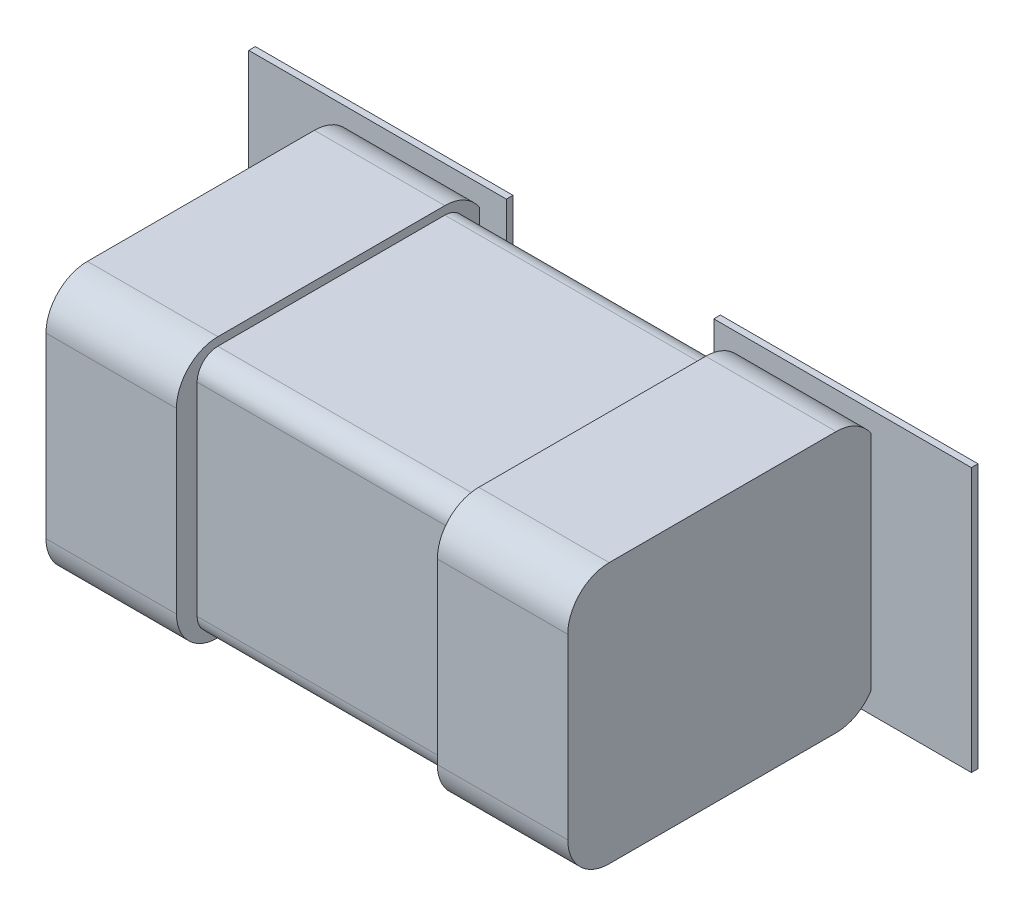
ISO-10303-21;
HEADER;
FILE_DESCRIPTION(('STEP AP214'),'2;1');
FILE_NAME('part.step','',(''),(''),'','','');
FILE_SCHEMA(('AUTOMOTIVE_DESIGN { 1 0 10303 214 1 1 1 1 }'));
ENDSEC;
DATA;
#1=APPLICATION_CONTEXT('core data for automotive mechanical design processes');
#2=APPLICATION_PROTOCOL_DEFINITION('international standard','automotive_design',2000,#1);
#3=PRODUCT_CONTEXT('',#1,'mechanical');
#4=PRODUCT('Part','Part','',(#3));
#5=PRODUCT_RELATED_PRODUCT_CATEGORY('part','',(#4));
#6=PRODUCT_DEFINITION_FORMATION('','',#4);
#7=PRODUCT_DEFINITION_CONTEXT('part definition',#1,'design');
#8=PRODUCT_DEFINITION('design','',#6,#7);
#9=PRODUCT_DEFINITION_SHAPE('','',#8);
#10=(LENGTH_UNIT() NAMED_UNIT(*) SI_UNIT(.MILLI.,.METRE.));
#11=(NAMED_UNIT(*) PLANE_ANGLE_UNIT() SI_UNIT($,.RADIAN.));
#12=(NAMED_UNIT(*) SI_UNIT($,.STERADIAN.) SOLID_ANGLE_UNIT());
#13=UNCERTAINTY_MEASURE_WITH_UNIT(LENGTH_MEASURE(1.E-05),#10,'distance_accuracy_value','');
#14=(GEOMETRIC_REPRESENTATION_CONTEXT(3) GLOBAL_UNCERTAINTY_ASSIGNED_CONTEXT((#13)) GLOBAL_UNIT_ASSIGNED_CONTEXT((#10,
#11,#12)) REPRESENTATION_CONTEXT('',''));
#15=CARTESIAN_POINT('',(0.,0.,0.));
#16=DIRECTION('',(0.,0.,1.));
#17=DIRECTION('',(1.,0.,0.));
#18=AXIS2_PLACEMENT_3D('',#15,#16,#17);
#19=CARTESIAN_POINT('',(0.,0.,0.0762));
#20=DIRECTION('',(0.,0.,1.));
#21=DIRECTION('',(1.,0.,0.));
#22=AXIS2_PLACEMENT_3D('',#19,#20,#21);
#23=PLANE('',#22);
#24=DIRECTION('',(0.,1.,0.));
#25=VECTOR('',#24,1.);
#26=CARTESIAN_POINT('',(0.318008,0.405003,0.0762));
#27=LINE('',#26,#25);
#28=CARTESIAN_POINT('',(0.318008,0.405003,0.0762));
#29=VERTEX_POINT('',#28);
#30=CARTESIAN_POINT('',(0.318008,-0.405003,0.0762));
#31=VERTEX_POINT('',#30);
#32=EDGE_CURVE('E229',#29,#31,#27,.F.);
#33=ORIENTED_EDGE('',*,*,#32,.F.);
#34=DIRECTION('',(1.,0.,0.));
#35=VECTOR('',#34,1.);
#36=CARTESIAN_POINT('',(1.1079988,0.405003,0.0762));
#37=LINE('',#36,#35);
#38=CARTESIAN_POINT('',(1.1079988,0.405003,0.0762));
#39=VERTEX_POINT('',#38);
#40=EDGE_CURVE('E216',#39,#29,#37,.F.);
#41=ORIENTED_EDGE('',*,*,#40,.F.);
#42=DIRECTION('',(0.,1.,0.));
#43=VECTOR('',#42,1.);
#44=CARTESIAN_POINT('',(1.1079988,-0.405003,0.0762));
#45=LINE('',#44,#43);
#46=CARTESIAN_POINT('',(1.1079988,-0.405003,0.0762));
#47=VERTEX_POINT('',#46);
#48=EDGE_CURVE('E357',#47,#39,#45,.T.);
#49=ORIENTED_EDGE('',*,*,#48,.F.);
#50=DIRECTION('',(1.,0.,0.));
#51=VECTOR('',#50,1.);
#52=CARTESIAN_POINT('',(0.318008,-0.405003,0.0762));
#53=LINE('',#52,#51);
#54=EDGE_CURVE('E230',#31,#47,#53,.T.);
#55=ORIENTED_EDGE('',*,*,#54,.F.);
#56=EDGE_LOOP('',(#33,#41,#49,#55));
#57=FACE_BOUND('',#56,.T.);
#58=ADVANCED_FACE('F17',(#57),#23,.F.);
#59=CARTESIAN_POINT('',(1.1079988,0.405003,0.0762));
#60=DIRECTION('',(0.,1.,0.));
#61=DIRECTION('',(0.,0.,1.));
#62=AXIS2_PLACEMENT_3D('',#59,#60,#61);
#63=PLANE('',#62);
#64=DIRECTION('',(0.,0.,-1.));
#65=VECTOR('',#64,1.);
#66=CARTESIAN_POINT('',(1.1079988,0.405003,0.0762));
#67=LINE('',#66,#65);
#68=CARTESIAN_POINT('',(1.1079988,0.405003,0.09652));
#69=VERTEX_POINT('',#68);
#70=EDGE_CURVE('E223',#39,#69,#67,.F.);
#71=ORIENTED_EDGE('',*,*,#70,.F.);
#72=ORIENTED_EDGE('',*,*,#40,.T.);
#73=DIRECTION('',(0.,0.,1.));
#74=VECTOR('',#73,1.);
#75=CARTESIAN_POINT('',(0.318008,0.405003,0.0762));
#76=LINE('',#75,#74);
#77=CARTESIAN_POINT('',(0.318008,0.405003,0.09652));
#78=VERTEX_POINT('',#77);
#79=EDGE_CURVE('E220',#78,#29,#76,.F.);
#80=ORIENTED_EDGE('',*,*,#79,.F.);
#81=DIRECTION('',(1.,0.,0.));
#82=VECTOR('',#81,1.);
#83=CARTESIAN_POINT('',(0.,0.405003,0.09652));
#84=LINE('',#83,#82);
#85=EDGE_CURVE('E355',#69,#78,#84,.F.);
#86=ORIENTED_EDGE('',*,*,#85,.F.);
#87=EDGE_LOOP('',(#71,#72,#80,#86));
#88=FACE_BOUND('',#87,.T.);
#89=ADVANCED_FACE('F218',(#88),#63,.T.);
#90=CARTESIAN_POINT('',(0.318008,0.405003,0.0762));
#91=DIRECTION('',(-1.,0.,0.));
#92=DIRECTION('',(0.,0.,1.));
#93=AXIS2_PLACEMENT_3D('',#90,#91,#92);
#94=PLANE('',#93);
#95=ORIENTED_EDGE('',*,*,#79,.T.);
#96=ORIENTED_EDGE('',*,*,#32,.T.);
#97=DIRECTION('',(0.,0.,-1.));
#98=VECTOR('',#97,1.);
#99=CARTESIAN_POINT('',(0.318008,-0.405003,0.0762));
#100=LINE('',#99,#98);
#101=CARTESIAN_POINT('',(0.318008,-0.405003,0.09652));
#102=VERTEX_POINT('',#101);
#103=EDGE_CURVE('E233',#102,#31,#100,.T.);
#104=ORIENTED_EDGE('',*,*,#103,.F.);
#105=DIRECTION('',(0.,1.,0.));
#106=VECTOR('',#105,1.);
#107=CARTESIAN_POINT('',(0.318008,0.,0.09652));
#108=LINE('',#107,#106);
#109=EDGE_CURVE('E237',#78,#102,#108,.F.);
#110=ORIENTED_EDGE('',*,*,#109,.F.);
#111=EDGE_LOOP('',(#95,#96,#104,#110));
#112=FACE_BOUND('',#111,.T.);
#113=ADVANCED_FACE('F235',(#112),#94,.T.);
#114=CARTESIAN_POINT('',(0.318008,-0.405003,0.0762));
#115=DIRECTION('',(0.,-1.,0.));
#116=DIRECTION('',(0.,0.,-1.));
#117=AXIS2_PLACEMENT_3D('',#114,#115,#116);
#118=PLANE('',#117);
#119=ORIENTED_EDGE('',*,*,#103,.T.);
#120=ORIENTED_EDGE('',*,*,#54,.T.);
#121=DIRECTION('',(0.,0.,-1.));
#122=VECTOR('',#121,1.);
#123=CARTESIAN_POINT('',(1.1079988,-0.405003,0.0762));
#124=LINE('',#123,#122);
#125=CARTESIAN_POINT('',(1.1079988,-0.405003,0.09652));
#126=VERTEX_POINT('',#125);
#127=EDGE_CURVE('E192',#126,#47,#124,.T.);
#128=ORIENTED_EDGE('',*,*,#127,.F.);
#129=DIRECTION('',(1.,0.,0.));
#130=VECTOR('',#129,1.);
#131=CARTESIAN_POINT('',(0.,-0.405003,0.09652));
#132=LINE('',#131,#130);
#133=EDGE_CURVE('E351',#102,#126,#132,.T.);
#134=ORIENTED_EDGE('',*,*,#133,.F.);
#135=EDGE_LOOP('',(#119,#120,#128,#134));
#136=FACE_BOUND('',#135,.T.);
#137=ADVANCED_FACE('F368',(#136),#118,.T.);
#138=CARTESIAN_POINT('',(1.1079988,-0.405003,0.0762));
#139=DIRECTION('',(1.,0.,0.));
#140=DIRECTION('',(0.,0.,-1.));
#141=AXIS2_PLACEMENT_3D('',#138,#139,#140);
#142=PLANE('',#141);
#143=ORIENTED_EDGE('',*,*,#127,.T.);
#144=ORIENTED_EDGE('',*,*,#48,.T.);
#145=ORIENTED_EDGE('',*,*,#70,.T.);
#146=DIRECTION('',(0.,1.,0.));
#147=VECTOR('',#146,1.);
#148=CARTESIAN_POINT('',(1.1079988,0.,0.09652));
#149=LINE('',#148,#147);
#150=EDGE_CURVE('E348',#126,#69,#149,.T.);
#151=ORIENTED_EDGE('',*,*,#150,.F.);
#152=EDGE_LOOP('',(#143,#144,#145,#151));
#153=FACE_BOUND('',#152,.T.);
#154=ADVANCED_FACE('F372',(#153),#142,.T.);
#155=CARTESIAN_POINT('',(0.800000000000102,-0.399999999999924,0.0762));
#156=DIRECTION('',(1.,0.,0.));
#157=DIRECTION('',(0.,0.,-1.));
#158=AXIS2_PLACEMENT_3D('',#155,#156,#157);
#159=PLANE('',#158);
#160=CARTESIAN_POINT('',(0.800000000000102,-0.272999999999924,0.2032));
#161=DIRECTION('',(1.,0.,0.));
#162=DIRECTION('',(0.,0.,-1.));
#163=AXIS2_PLACEMENT_3D('',#160,#161,#162);
#164=CIRCLE('',#163,0.127);
#165=CARTESIAN_POINT('',(0.800000000000102,-0.341908472628476,0.0965199999999994));
#166=VERTEX_POINT('',#165);
#167=CARTESIAN_POINT('',(0.800000000000102,-0.399999999999924,0.2032));
#168=VERTEX_POINT('',#167);
#169=EDGE_CURVE('E319',#166,#168,#164,.F.);
#170=ORIENTED_EDGE('',*,*,#169,.F.);
#171=DIRECTION('',(0.,1.,0.));
#172=VECTOR('',#171,1.);
#173=CARTESIAN_POINT('',(0.800000000000102,0.,0.09652));
#174=LINE('',#173,#172);
#175=CARTESIAN_POINT('',(0.800000000000102,0.341908472628476,0.0965199999999994));
#176=VERTEX_POINT('',#175);
#177=EDGE_CURVE('E183',#176,#166,#174,.F.);
#178=ORIENTED_EDGE('',*,*,#177,.F.);
#179=CARTESIAN_POINT('',(0.800000000000102,0.272999999999924,0.2032));
#180=DIRECTION('',(1.,0.,0.));
#181=DIRECTION('',(0.,0.,-1.));
#182=AXIS2_PLACEMENT_3D('',#179,#180,#181);
#183=CIRCLE('',#182,0.127);
#184=CARTESIAN_POINT('',(0.800000000000102,0.399999999999924,0.2032));
#185=VERTEX_POINT('',#184);
#186=EDGE_CURVE('E20',#185,#176,#183,.F.);
#187=ORIENTED_EDGE('',*,*,#186,.F.);
#188=DIRECTION('',(0.,0.,1.));
#189=VECTOR('',#188,1.);
#190=CARTESIAN_POINT('',(0.800000000000102,0.399999999999924,0.0762));
#191=LINE('',#190,#189);
#192=CARTESIAN_POINT('',(0.800000000000102,0.399999999999924,0.89916));
#193=VERTEX_POINT('',#192);
#194=EDGE_CURVE('E337',#193,#185,#191,.F.);
#195=ORIENTED_EDGE('',*,*,#194,.F.);
#196=CARTESIAN_POINT('',(0.800000000000102,0.272999999999924,0.89916));
#197=DIRECTION('',(-1.,0.,0.));
#198=DIRECTION('',(0.,0.,1.));
#199=AXIS2_PLACEMENT_3D('',#196,#197,#198);
#200=CIRCLE('',#199,0.127);
#201=CARTESIAN_POINT('',(0.800000000000102,0.272999999999924,1.02616));
#202=VERTEX_POINT('',#201);
#203=EDGE_CURVE('E327',#202,#193,#200,.T.);
#204=ORIENTED_EDGE('',*,*,#203,.F.);
#205=DIRECTION('',(0.,1.,0.));
#206=VECTOR('',#205,1.);
#207=CARTESIAN_POINT('',(0.800000000000102,0.,1.02616));
#208=LINE('',#207,#206);
#209=CARTESIAN_POINT('',(0.800000000000102,-0.272999999999924,1.02616));
#210=VERTEX_POINT('',#209);
#211=EDGE_CURVE('E334',#210,#202,#208,.T.);
#212=ORIENTED_EDGE('',*,*,#211,.F.);
#213=CARTESIAN_POINT('',(0.800000000000102,-0.272999999999924,0.89916));
#214=DIRECTION('',(1.,0.,0.));
#215=DIRECTION('',(0.,0.,-1.));
#216=AXIS2_PLACEMENT_3D('',#213,#214,#215);
#217=CIRCLE('',#216,0.127);
#218=CARTESIAN_POINT('',(0.800000000000102,-0.399999999999924,0.89916));
#219=VERTEX_POINT('',#218);
#220=EDGE_CURVE('E323',#219,#210,#217,.F.);
#221=ORIENTED_EDGE('',*,*,#220,.F.);
#222=DIRECTION('',(0.,0.,-1.));
#223=VECTOR('',#222,1.);
#224=CARTESIAN_POINT('',(0.800000000000102,-0.399999999999924,0.0762));
#225=LINE('',#224,#223);
#226=EDGE_CURVE('E325',#168,#219,#225,.F.);
#227=ORIENTED_EDGE('',*,*,#226,.F.);
#228=EDGE_LOOP('',(#170,#178,#187,#195,#204,#212,#221,#227));
#229=FACE_BOUND('',#228,.T.);
#230=ADVANCED_FACE('F374',(#229),#159,.T.);
#231=CARTESIAN_POINT('',(0.,0.,0.09652));
#232=DIRECTION('',(0.,0.,1.));
#233=DIRECTION('',(1.,0.,0.));
#234=AXIS2_PLACEMENT_3D('',#231,#232,#233);
#235=PLANE('',#234);
#236=DIRECTION('',(1.,0.,0.));
#237=VECTOR('',#236,1.);
#238=CARTESIAN_POINT('',(0.800000000000102,0.341908472628475,0.0965199999999988));
#239=LINE('',#238,#237);
#240=CARTESIAN_POINT('',(0.399999999999924,0.341908472628476,0.0965199999999994));
#241=VERTEX_POINT('',#240);
#242=EDGE_CURVE('E345',#176,#241,#239,.F.);
#243=ORIENTED_EDGE('',*,*,#242,.F.);
#244=ORIENTED_EDGE('',*,*,#177,.T.);
#245=DIRECTION('',(1.,0.,0.));
#246=VECTOR('',#245,1.);
#247=CARTESIAN_POINT('',(0.800000000000102,-0.341908472628475,0.0965199999999988));
#248=LINE('',#247,#246);
#249=CARTESIAN_POINT('',(0.399999999999924,-0.341908472628476,0.0965199999999994));
#250=VERTEX_POINT('',#249);
#251=EDGE_CURVE('E322',#250,#166,#248,.T.);
#252=ORIENTED_EDGE('',*,*,#251,.F.);
#253=DIRECTION('',(0.,1.,0.));
#254=VECTOR('',#253,1.);
#255=CARTESIAN_POINT('',(0.399999999999924,0.374599999999924,0.09652));
#256=LINE('',#255,#254);
#257=EDGE_CURVE('E318',#250,#241,#256,.T.);
#258=ORIENTED_EDGE('',*,*,#257,.T.);
#259=EDGE_LOOP('',(#243,#244,#252,#258));
#260=FACE_BOUND('',#259,.T.);
#261=ORIENTED_EDGE('',*,*,#133,.T.);
#262=ORIENTED_EDGE('',*,*,#150,.T.);
#263=ORIENTED_EDGE('',*,*,#85,.T.);
#264=ORIENTED_EDGE('',*,*,#109,.T.);
#265=EDGE_LOOP('',(#261,#262,#263,#264));
#266=FACE_BOUND('',#265,.T.);
#267=ADVANCED_FACE('F370',(#260,#266),#235,.T.);
#268=CARTESIAN_POINT('',(0.800000000000102,0.272999999999924,0.2032));
#269=DIRECTION('',(1.,0.,0.));
#270=DIRECTION('',(0.,0.,-1.));
#271=AXIS2_PLACEMENT_3D('',#268,#269,#270);
#272=CYLINDRICAL_SURFACE('',#271,0.127);
#273=DIRECTION('',(1.,0.,0.));
#274=VECTOR('',#273,1.);
#275=CARTESIAN_POINT('',(0.800000000000102,0.399999999999924,0.2032));
#276=LINE('',#275,#274);
#277=CARTESIAN_POINT('',(0.399999999999924,0.399999999999924,0.2032));
#278=VERTEX_POINT('',#277);
#279=EDGE_CURVE('E330',#185,#278,#276,.F.);
#280=ORIENTED_EDGE('',*,*,#279,.F.);
#281=ORIENTED_EDGE('',*,*,#186,.T.);
#282=ORIENTED_EDGE('',*,*,#242,.T.);
#283=CARTESIAN_POINT('',(0.399999999999924,0.272999999999924,0.2032));
#284=DIRECTION('',(1.,0.,0.));
#285=DIRECTION('',(0.,0.,-1.));
#286=AXIS2_PLACEMENT_3D('',#283,#284,#285);
#287=CIRCLE('',#286,0.127);
#288=EDGE_CURVE('E316',#241,#278,#287,.T.);
#289=ORIENTED_EDGE('',*,*,#288,.T.);
#290=EDGE_LOOP('',(#280,#281,#282,#289));
#291=FACE_BOUND('',#290,.T.);
#292=ADVANCED_FACE('F503',(#291),#272,.T.);
#293=CARTESIAN_POINT('',(0.800000000000102,0.399999999999924,0.0762));
#294=DIRECTION('',(0.,1.,0.));
#295=DIRECTION('',(0.,0.,1.));
#296=AXIS2_PLACEMENT_3D('',#293,#294,#295);
#297=PLANE('',#296);
#298=ORIENTED_EDGE('',*,*,#194,.T.);
#299=ORIENTED_EDGE('',*,*,#279,.T.);
#300=DIRECTION('',(0.,0.,-1.));
#301=VECTOR('',#300,1.);
#302=CARTESIAN_POINT('',(0.399999999999924,0.399999999999924,1.02616));
#303=LINE('',#302,#301);
#304=CARTESIAN_POINT('',(0.399999999999924,0.399999999999924,0.89916));
#305=VERTEX_POINT('',#304);
#306=EDGE_CURVE('E315',#278,#305,#303,.F.);
#307=ORIENTED_EDGE('',*,*,#306,.T.);
#308=DIRECTION('',(-1.,0.,0.));
#309=VECTOR('',#308,1.);
#310=CARTESIAN_POINT('',(0.803760403241536,0.399999999999924,0.89916));
#311=LINE('',#310,#309);
#312=EDGE_CURVE('E329',#193,#305,#311,.T.);
#313=ORIENTED_EDGE('',*,*,#312,.F.);
#314=EDGE_LOOP('',(#298,#299,#307,#313));
#315=FACE_BOUND('',#314,.T.);
#316=ADVANCED_FACE('F500',(#315),#297,.T.);
#317=CARTESIAN_POINT('',(0.803760403241536,0.272999999999924,0.89916));
#318=DIRECTION('',(-1.,0.,0.));
#319=DIRECTION('',(0.,0.,1.));
#320=AXIS2_PLACEMENT_3D('',#317,#318,#319);
#321=CYLINDRICAL_SURFACE('',#320,0.127);
#322=ORIENTED_EDGE('',*,*,#312,.T.);
#323=CARTESIAN_POINT('',(0.399999999999924,0.272999999999924,0.89916));
#324=DIRECTION('',(-1.,0.,0.));
#325=DIRECTION('',(0.,0.,1.));
#326=AXIS2_PLACEMENT_3D('',#323,#324,#325);
#327=CIRCLE('',#326,0.127);
#328=CARTESIAN_POINT('',(0.399999999999924,0.272999999999924,1.02616));
#329=VERTEX_POINT('',#328);
#330=EDGE_CURVE('E313',#305,#329,#327,.F.);
#331=ORIENTED_EDGE('',*,*,#330,.T.);
#332=DIRECTION('',(1.,0.,0.));
#333=VECTOR('',#332,1.);
#334=CARTESIAN_POINT('',(0.,0.272999999999924,1.02616));
#335=LINE('',#334,#333);
#336=EDGE_CURVE('E363',#202,#329,#335,.F.);
#337=ORIENTED_EDGE('',*,*,#336,.F.);
#338=ORIENTED_EDGE('',*,*,#203,.T.);
#339=EDGE_LOOP('',(#322,#331,#337,#338));
#340=FACE_BOUND('',#339,.T.);
#341=ADVANCED_FACE('F496',(#340),#321,.T.);
#342=CARTESIAN_POINT('',(0.,0.,1.02616));
#343=DIRECTION('',(0.,0.,1.));
#344=DIRECTION('',(1.,0.,0.));
#345=AXIS2_PLACEMENT_3D('',#342,#343,#344);
#346=PLANE('',#345);
#347=ORIENTED_EDGE('',*,*,#211,.T.);
#348=ORIENTED_EDGE('',*,*,#336,.T.);
#349=DIRECTION('',(0.,1.,0.));
#350=VECTOR('',#349,1.);
#351=CARTESIAN_POINT('',(0.399999999999924,0.374599999999924,1.02616));
#352=LINE('',#351,#350);
#353=CARTESIAN_POINT('',(0.399999999999924,-0.272999999999924,1.02616));
#354=VERTEX_POINT('',#353);
#355=EDGE_CURVE('E312',#329,#354,#352,.F.);
#356=ORIENTED_EDGE('',*,*,#355,.T.);
#357=DIRECTION('',(1.,0.,0.));
#358=VECTOR('',#357,1.);
#359=CARTESIAN_POINT('',(-0.80391086820375,-0.272999999999924,1.02616));
#360=LINE('',#359,#358);
#361=EDGE_CURVE('E326',#210,#354,#360,.F.);
#362=ORIENTED_EDGE('',*,*,#361,.F.);
#363=EDGE_LOOP('',(#347,#348,#356,#362));
#364=FACE_BOUND('',#363,.T.);
#365=ADVANCED_FACE('F492',(#364),#346,.T.);
#366=CARTESIAN_POINT('',(-0.80391086820375,-0.272999999999924,0.89916));
#367=DIRECTION('',(1.,0.,0.));
#368=DIRECTION('',(0.,0.,-1.));
#369=AXIS2_PLACEMENT_3D('',#366,#367,#368);
#370=CYLINDRICAL_SURFACE('',#369,0.127);
#371=DIRECTION('',(1.,0.,0.));
#372=VECTOR('',#371,1.);
#373=CARTESIAN_POINT('',(-0.800000000000102,-0.399999999999924,0.89916));
#374=LINE('',#373,#372);
#375=CARTESIAN_POINT('',(0.399999999999924,-0.399999999999924,0.89916));
#376=VERTEX_POINT('',#375);
#377=EDGE_CURVE('E361',#219,#376,#374,.F.);
#378=ORIENTED_EDGE('',*,*,#377,.F.);
#379=ORIENTED_EDGE('',*,*,#220,.T.);
#380=ORIENTED_EDGE('',*,*,#361,.T.);
#381=CARTESIAN_POINT('',(0.399999999999924,-0.272999999999924,0.89916));
#382=DIRECTION('',(1.,0.,0.));
#383=DIRECTION('',(0.,0.,-1.));
#384=AXIS2_PLACEMENT_3D('',#381,#382,#383);
#385=CIRCLE('',#384,0.127);
#386=EDGE_CURVE('E310',#354,#376,#385,.T.);
#387=ORIENTED_EDGE('',*,*,#386,.T.);
#388=EDGE_LOOP('',(#378,#379,#380,#387));
#389=FACE_BOUND('',#388,.T.);
#390=ADVANCED_FACE('F488',(#389),#370,.T.);
#391=CARTESIAN_POINT('',(-0.800000000000102,-0.399999999999924,0.0762));
#392=DIRECTION('',(0.,-1.,0.));
#393=DIRECTION('',(0.,0.,-1.));
#394=AXIS2_PLACEMENT_3D('',#391,#392,#393);
#395=PLANE('',#394);
#396=DIRECTION('',(0.,0.,-1.));
#397=VECTOR('',#396,1.);
#398=CARTESIAN_POINT('',(0.399999999999924,-0.399999999999924,1.02616));
#399=LINE('',#398,#397);
#400=CARTESIAN_POINT('',(0.399999999999924,-0.399999999999924,0.2032));
#401=VERTEX_POINT('',#400);
#402=EDGE_CURVE('E309',#376,#401,#399,.T.);
#403=ORIENTED_EDGE('',*,*,#402,.T.);
#404=DIRECTION('',(1.,0.,0.));
#405=VECTOR('',#404,1.);
#406=CARTESIAN_POINT('',(0.800000000000102,-0.399999999999924,0.2032));
#407=LINE('',#406,#405);
#408=EDGE_CURVE('E526',#168,#401,#407,.F.);
#409=ORIENTED_EDGE('',*,*,#408,.F.);
#410=ORIENTED_EDGE('',*,*,#226,.T.);
#411=ORIENTED_EDGE('',*,*,#377,.T.);
#412=EDGE_LOOP('',(#403,#409,#410,#411));
#413=FACE_BOUND('',#412,.T.);
#414=ADVANCED_FACE('F484',(#413),#395,.T.);
#415=CARTESIAN_POINT('',(0.800000000000102,-0.272999999999924,0.2032));
#416=DIRECTION('',(1.,0.,0.));
#417=DIRECTION('',(0.,0.,-1.));
#418=AXIS2_PLACEMENT_3D('',#415,#416,#417);
#419=CYLINDRICAL_SURFACE('',#418,0.127);
#420=ORIENTED_EDGE('',*,*,#251,.T.);
#421=ORIENTED_EDGE('',*,*,#169,.T.);
#422=ORIENTED_EDGE('',*,*,#408,.T.);
#423=CARTESIAN_POINT('',(0.399999999999924,-0.272999999999924,0.2032));
#424=DIRECTION('',(1.,0.,0.));
#425=DIRECTION('',(0.,0.,-1.));
#426=AXIS2_PLACEMENT_3D('',#423,#424,#425);
#427=CIRCLE('',#426,0.127);
#428=EDGE_CURVE('E306',#401,#250,#427,.T.);
#429=ORIENTED_EDGE('',*,*,#428,.T.);
#430=EDGE_LOOP('',(#420,#421,#422,#429));
#431=FACE_BOUND('',#430,.T.);
#432=ADVANCED_FACE('F480',(#431),#419,.T.);
#433=CARTESIAN_POINT('',(0.399999999999924,0.374599999999924,1.02616));
#434=DIRECTION('',(1.,0.,0.));
#435=DIRECTION('',(0.,0.,-1.));
#436=AXIS2_PLACEMENT_3D('',#433,#434,#435);
#437=PLANE('',#436);
#438=DIRECTION('',(0.,0.,1.));
#439=VECTOR('',#438,1.);
#440=CARTESIAN_POINT('',(0.399999999999924,-0.374599999999924,1.02616));
#441=LINE('',#440,#439);
#442=CARTESIAN_POINT('',(0.399999999999924,-0.374599999999924,0.89916));
#443=VERTEX_POINT('',#442);
#444=CARTESIAN_POINT('',(0.399999999999924,-0.374599999999924,0.2032));
#445=VERTEX_POINT('',#444);
#446=EDGE_CURVE('E295',#443,#445,#441,.F.);
#447=ORIENTED_EDGE('',*,*,#446,.T.);
#448=CARTESIAN_POINT('',(0.399999999999924,-0.311099999999924,0.2032));
#449=DIRECTION('',(1.,0.,0.));
#450=DIRECTION('',(0.,0.,-1.));
#451=AXIS2_PLACEMENT_3D('',#448,#449,#450);
#452=CIRCLE('',#451,0.0635);
#453=CARTESIAN_POINT('',(0.399999999999924,-0.311099999999924,0.1397));
#454=VERTEX_POINT('',#453);
#455=EDGE_CURVE('E291',#454,#445,#452,.F.);
#456=ORIENTED_EDGE('',*,*,#455,.F.);
#457=DIRECTION('',(0.,1.,0.));
#458=VECTOR('',#457,1.);
#459=CARTESIAN_POINT('',(0.399999999999924,0.374599999999924,0.1397));
#460=LINE('',#459,#458);
#461=CARTESIAN_POINT('',(0.399999999999924,0.311099999999924,0.1397));
#462=VERTEX_POINT('',#461);
#463=EDGE_CURVE('E537',#454,#462,#460,.T.);
#464=ORIENTED_EDGE('',*,*,#463,.T.);
#465=CARTESIAN_POINT('',(0.399999999999924,0.311099999999924,0.2032));
#466=DIRECTION('',(-1.,0.,0.));
#467=DIRECTION('',(0.,0.,1.));
#468=AXIS2_PLACEMENT_3D('',#465,#466,#467);
#469=CIRCLE('',#468,0.0635);
#470=CARTESIAN_POINT('',(0.399999999999924,0.374599999999924,0.2032));
#471=VERTEX_POINT('',#470);
#472=EDGE_CURVE('E286',#471,#462,#469,.T.);
#473=ORIENTED_EDGE('',*,*,#472,.F.);
#474=DIRECTION('',(0.,0.,-1.));
#475=VECTOR('',#474,1.);
#476=CARTESIAN_POINT('',(0.399999999999924,0.374599999999924,1.02616));
#477=LINE('',#476,#475);
#478=CARTESIAN_POINT('',(0.399999999999924,0.374599999999924,0.89916));
#479=VERTEX_POINT('',#478);
#480=EDGE_CURVE('E305',#471,#479,#477,.F.);
#481=ORIENTED_EDGE('',*,*,#480,.T.);
#482=CARTESIAN_POINT('',(0.399999999999924,0.311099999999924,0.89916));
#483=DIRECTION('',(1.,0.,0.));
#484=DIRECTION('',(0.,0.,-1.));
#485=AXIS2_PLACEMENT_3D('',#482,#483,#484);
#486=CIRCLE('',#485,0.0635);
#487=CARTESIAN_POINT('',(0.399999999999924,0.311099999999924,0.96266));
#488=VERTEX_POINT('',#487);
#489=EDGE_CURVE('E301',#488,#479,#486,.F.);
#490=ORIENTED_EDGE('',*,*,#489,.F.);
#491=DIRECTION('',(0.,1.,0.));
#492=VECTOR('',#491,1.);
#493=CARTESIAN_POINT('',(0.399999999999924,0.374599999999924,0.96266));
#494=LINE('',#493,#492);
#495=CARTESIAN_POINT('',(0.399999999999924,-0.311099999999924,0.96266));
#496=VERTEX_POINT('',#495);
#497=EDGE_CURVE('E300',#488,#496,#494,.F.);
#498=ORIENTED_EDGE('',*,*,#497,.T.);
#499=CARTESIAN_POINT('',(0.399999999999924,-0.311099999999924,0.89916));
#500=DIRECTION('',(-1.,0.,0.));
#501=DIRECTION('',(0.,0.,1.));
#502=AXIS2_PLACEMENT_3D('',#499,#500,#501);
#503=CIRCLE('',#502,0.0635);
#504=EDGE_CURVE('E296',#443,#496,#503,.T.);
#505=ORIENTED_EDGE('',*,*,#504,.F.);
#506=EDGE_LOOP('',(#447,#456,#464,#473,#481,#490,#498,#505));
#507=FACE_BOUND('',#506,.T.);
#508=ORIENTED_EDGE('',*,*,#402,.F.);
#509=ORIENTED_EDGE('',*,*,#386,.F.);
#510=ORIENTED_EDGE('',*,*,#355,.F.);
#511=ORIENTED_EDGE('',*,*,#330,.F.);
#512=ORIENTED_EDGE('',*,*,#306,.F.);
#513=ORIENTED_EDGE('',*,*,#288,.F.);
#514=ORIENTED_EDGE('',*,*,#257,.F.);
#515=ORIENTED_EDGE('',*,*,#428,.F.);
#516=EDGE_LOOP('',(#508,#509,#510,#511,#512,#513,#514,#515));
#517=FACE_BOUND('',#516,.T.);
#518=ADVANCED_FACE('F476',(#507,#517),#437,.F.);
#519=CARTESIAN_POINT('',(0.,0.,0.0762));
#520=DIRECTION('',(0.,0.,1.));
#521=DIRECTION('',(1.,0.,0.));
#522=AXIS2_PLACEMENT_3D('',#519,#520,#521);
#523=PLANE('',#522);
#524=DIRECTION('',(0.,1.,0.));
#525=VECTOR('',#524,1.);
#526=CARTESIAN_POINT('',(-0.318008,-0.405003,0.0762));
#527=LINE('',#526,#525);
#528=CARTESIAN_POINT('',(-0.318008,-0.405003,0.0762));
#529=VERTEX_POINT('',#528);
#530=CARTESIAN_POINT('',(-0.318008,0.405003,0.0762));
#531=VERTEX_POINT('',#530);
#532=EDGE_CURVE('E577',#529,#531,#527,.T.);
#533=ORIENTED_EDGE('',*,*,#532,.F.);
#534=DIRECTION('',(1.,0.,0.));
#535=VECTOR('',#534,1.);
#536=CARTESIAN_POINT('',(-1.1079988,-0.405003,0.0762));
#537=LINE('',#536,#535);
#538=CARTESIAN_POINT('',(-1.1079988,-0.405003,0.0762));
#539=VERTEX_POINT('',#538);
#540=EDGE_CURVE('E565',#539,#529,#537,.T.);
#541=ORIENTED_EDGE('',*,*,#540,.F.);
#542=DIRECTION('',(0.,1.,0.));
#543=VECTOR('',#542,1.);
#544=CARTESIAN_POINT('',(-1.1079988,0.405003,0.0762));
#545=LINE('',#544,#543);
#546=CARTESIAN_POINT('',(-1.1079988,0.405003,0.0762));
#547=VERTEX_POINT('',#546);
#548=EDGE_CURVE('E592',#547,#539,#545,.F.);
#549=ORIENTED_EDGE('',*,*,#548,.F.);
#550=DIRECTION('',(1.,0.,0.));
#551=VECTOR('',#550,1.);
#552=CARTESIAN_POINT('',(-0.318008,0.405003,0.0762));
#553=LINE('',#552,#551);
#554=EDGE_CURVE('E583',#531,#547,#553,.F.);
#555=ORIENTED_EDGE('',*,*,#554,.F.);
#556=EDGE_LOOP('',(#533,#541,#549,#555));
#557=FACE_BOUND('',#556,.T.);
#558=ADVANCED_FACE('F472',(#557),#523,.F.);
#559=CARTESIAN_POINT('',(-0.399999999999924,0.374599999999924,1.02616));
#560=DIRECTION('',(0.,-1.,0.));
#561=DIRECTION('',(0.,0.,-1.));
#562=AXIS2_PLACEMENT_3D('',#559,#560,#561);
#563=PLANE('',#562);
#564=DIRECTION('',(1.,0.,0.));
#565=VECTOR('',#564,1.);
#566=CARTESIAN_POINT('',(-0.404099483511126,0.374599999999924,0.89916));
#567=LINE('',#566,#565);
#568=CARTESIAN_POINT('',(-0.399999999999924,0.374599999999924,0.89916));
#569=VERTEX_POINT('',#568);
#570=EDGE_CURVE('E304',#479,#569,#567,.F.);
#571=ORIENTED_EDGE('',*,*,#570,.F.);
#572=ORIENTED_EDGE('',*,*,#480,.F.);
#573=DIRECTION('',(-1.,0.,0.));
#574=VECTOR('',#573,1.);
#575=CARTESIAN_POINT('',(0.403760403241612,0.374599999999924,0.2032));
#576=LINE('',#575,#574);
#577=CARTESIAN_POINT('',(-0.399999999999924,0.374599999999924,0.2032));
#578=VERTEX_POINT('',#577);
#579=EDGE_CURVE('E290',#578,#471,#576,.F.);
#580=ORIENTED_EDGE('',*,*,#579,.F.);
#581=DIRECTION('',(0.,0.,1.));
#582=VECTOR('',#581,1.);
#583=CARTESIAN_POINT('',(-0.399999999999924,0.374599999999924,1.02616));
#584=LINE('',#583,#582);
#585=EDGE_CURVE('E285',#578,#569,#584,.T.);
#586=ORIENTED_EDGE('',*,*,#585,.T.);
#587=EDGE_LOOP('',(#571,#572,#580,#586));
#588=FACE_BOUND('',#587,.T.);
#589=ADVANCED_FACE('F468',(#588),#563,.F.);
#590=CARTESIAN_POINT('',(-0.404099483511126,0.311099999999924,0.89916));
#591=DIRECTION('',(1.,0.,0.));
#592=DIRECTION('',(0.,0.,-1.));
#593=AXIS2_PLACEMENT_3D('',#590,#591,#592);
#594=CYLINDRICAL_SURFACE('',#593,0.0635);
#595=CARTESIAN_POINT('',(-0.399999999999924,0.311099999999924,0.89916));
#596=DIRECTION('',(1.,0.,0.));
#597=DIRECTION('',(0.,0.,-1.));
#598=AXIS2_PLACEMENT_3D('',#595,#596,#597);
#599=CIRCLE('',#598,0.0635);
#600=CARTESIAN_POINT('',(-0.399999999999924,0.311099999999924,0.96266));
#601=VERTEX_POINT('',#600);
#602=EDGE_CURVE('E283',#569,#601,#599,.T.);
#603=ORIENTED_EDGE('',*,*,#602,.T.);
#604=DIRECTION('',(-1.,0.,0.));
#605=VECTOR('',#604,1.);
#606=CARTESIAN_POINT('',(0.399999999999924,0.311099999999924,0.96266));
#607=LINE('',#606,#605);
#608=EDGE_CURVE('E544',#601,#488,#607,.F.);
#609=ORIENTED_EDGE('',*,*,#608,.T.);
#610=ORIENTED_EDGE('',*,*,#489,.T.);
#611=ORIENTED_EDGE('',*,*,#570,.T.);
#612=EDGE_LOOP('',(#603,#609,#610,#611));
#613=FACE_BOUND('',#612,.T.);
#614=ADVANCED_FACE('F464',(#613),#594,.T.);
#615=CARTESIAN_POINT('',(0.399999999999924,0.374599999999924,0.96266));
#616=DIRECTION('',(0.,0.,-1.));
#617=DIRECTION('',(-1.,0.,0.));
#618=AXIS2_PLACEMENT_3D('',#615,#616,#617);
#619=PLANE('',#618);
#620=DIRECTION('',(-1.,0.,0.));
#621=VECTOR('',#620,1.);
#622=CARTESIAN_POINT('',(0.403910868203572,-0.311099999999924,0.96266));
#623=LINE('',#622,#621);
#624=CARTESIAN_POINT('',(-0.399999999999924,-0.311099999999924,0.96266));
#625=VERTEX_POINT('',#624);
#626=EDGE_CURVE('E299',#496,#625,#623,.T.);
#627=ORIENTED_EDGE('',*,*,#626,.F.);
#628=ORIENTED_EDGE('',*,*,#497,.F.);
#629=ORIENTED_EDGE('',*,*,#608,.F.);
#630=DIRECTION('',(0.,1.,0.));
#631=VECTOR('',#630,1.);
#632=CARTESIAN_POINT('',(-0.399999999999924,0.399999999999924,0.96266));
#633=LINE('',#632,#631);
#634=EDGE_CURVE('E282',#601,#625,#633,.F.);
#635=ORIENTED_EDGE('',*,*,#634,.T.);
#636=EDGE_LOOP('',(#627,#628,#629,#635));
#637=FACE_BOUND('',#636,.T.);
#638=ADVANCED_FACE('F460',(#637),#619,.F.);
#639=CARTESIAN_POINT('',(0.403910868203572,-0.311099999999924,0.89916));
#640=DIRECTION('',(-1.,0.,0.));
#641=DIRECTION('',(0.,0.,1.));
#642=AXIS2_PLACEMENT_3D('',#639,#640,#641);
#643=CYLINDRICAL_SURFACE('',#642,0.0635);
#644=ORIENTED_EDGE('',*,*,#504,.T.);
#645=ORIENTED_EDGE('',*,*,#626,.T.);
#646=CARTESIAN_POINT('',(-0.399999999999924,-0.311099999999924,0.89916));
#647=DIRECTION('',(-1.,0.,0.));
#648=DIRECTION('',(0.,0.,1.));
#649=AXIS2_PLACEMENT_3D('',#646,#647,#648);
#650=CIRCLE('',#649,0.0635);
#651=CARTESIAN_POINT('',(-0.399999999999924,-0.374599999999924,0.89916));
#652=VERTEX_POINT('',#651);
#653=EDGE_CURVE('E280',#625,#652,#650,.F.);
#654=ORIENTED_EDGE('',*,*,#653,.T.);
#655=DIRECTION('',(1.,0.,0.));
#656=VECTOR('',#655,1.);
#657=CARTESIAN_POINT('',(0.399999999999924,-0.374599999999924,0.89916));
#658=LINE('',#657,#656);
#659=EDGE_CURVE('E543',#652,#443,#658,.T.);
#660=ORIENTED_EDGE('',*,*,#659,.T.);
#661=EDGE_LOOP('',(#644,#645,#654,#660));
#662=FACE_BOUND('',#661,.T.);
#663=ADVANCED_FACE('F456',(#662),#643,.T.);
#664=CARTESIAN_POINT('',(0.399999999999924,-0.374599999999924,1.02616));
#665=DIRECTION('',(0.,1.,0.));
#666=DIRECTION('',(0.,0.,1.));
#667=AXIS2_PLACEMENT_3D('',#664,#665,#666);
#668=PLANE('',#667);
#669=DIRECTION('',(1.,0.,0.));
#670=VECTOR('',#669,1.);
#671=CARTESIAN_POINT('',(-0.403760403241612,-0.374599999999924,0.2032));
#672=LINE('',#671,#670);
#673=CARTESIAN_POINT('',(-0.399999999999924,-0.374599999999924,0.2032));
#674=VERTEX_POINT('',#673);
#675=EDGE_CURVE('E294',#445,#674,#672,.F.);
#676=ORIENTED_EDGE('',*,*,#675,.F.);
#677=ORIENTED_EDGE('',*,*,#446,.F.);
#678=ORIENTED_EDGE('',*,*,#659,.F.);
#679=DIRECTION('',(0.,0.,1.));
#680=VECTOR('',#679,1.);
#681=CARTESIAN_POINT('',(-0.399999999999924,-0.374599999999924,1.02616));
#682=LINE('',#681,#680);
#683=EDGE_CURVE('E279',#652,#674,#682,.F.);
#684=ORIENTED_EDGE('',*,*,#683,.T.);
#685=EDGE_LOOP('',(#676,#677,#678,#684));
#686=FACE_BOUND('',#685,.T.);
#687=ADVANCED_FACE('F452',(#686),#668,.F.);
#688=CARTESIAN_POINT('',(-0.403760403241612,-0.311099999999924,0.2032));
#689=DIRECTION('',(1.,0.,0.));
#690=DIRECTION('',(0.,0.,-1.));
#691=AXIS2_PLACEMENT_3D('',#688,#689,#690);
#692=CYLINDRICAL_SURFACE('',#691,0.0635);
#693=CARTESIAN_POINT('',(-0.399999999999924,-0.311099999999924,0.2032));
#694=DIRECTION('',(1.,0.,0.));
#695=DIRECTION('',(0.,0.,-1.));
#696=AXIS2_PLACEMENT_3D('',#693,#694,#695);
#697=CIRCLE('',#696,0.0635);
#698=CARTESIAN_POINT('',(-0.399999999999924,-0.311099999999924,0.1397));
#699=VERTEX_POINT('',#698);
#700=EDGE_CURVE('E277',#674,#699,#697,.T.);
#701=ORIENTED_EDGE('',*,*,#700,.T.);
#702=DIRECTION('',(1.,0.,0.));
#703=VECTOR('',#702,1.);
#704=CARTESIAN_POINT('',(-0.399999999999924,-0.311099999999924,0.1397));
#705=LINE('',#704,#703);
#706=EDGE_CURVE('E558',#699,#454,#705,.T.);
#707=ORIENTED_EDGE('',*,*,#706,.T.);
#708=ORIENTED_EDGE('',*,*,#455,.T.);
#709=ORIENTED_EDGE('',*,*,#675,.T.);
#710=EDGE_LOOP('',(#701,#707,#708,#709));
#711=FACE_BOUND('',#710,.T.);
#712=ADVANCED_FACE('F448',(#711),#692,.T.);
#713=CARTESIAN_POINT('',(-0.399999999999924,0.374599999999924,0.1397));
#714=DIRECTION('',(0.,0.,1.));
#715=DIRECTION('',(1.,0.,0.));
#716=AXIS2_PLACEMENT_3D('',#713,#714,#715);
#717=PLANE('',#716);
#718=ORIENTED_EDGE('',*,*,#706,.F.);
#719=DIRECTION('',(0.,1.,0.));
#720=VECTOR('',#719,1.);
#721=CARTESIAN_POINT('',(-0.399999999999924,0.399999999999924,0.1397));
#722=LINE('',#721,#720);
#723=CARTESIAN_POINT('',(-0.399999999999924,0.311099999999924,0.1397));
#724=VERTEX_POINT('',#723);
#725=EDGE_CURVE('E276',#699,#724,#722,.T.);
#726=ORIENTED_EDGE('',*,*,#725,.T.);
#727=DIRECTION('',(-1.,0.,0.));
#728=VECTOR('',#727,1.);
#729=CARTESIAN_POINT('',(0.403760403241612,0.311099999999924,0.1397));
#730=LINE('',#729,#728);
#731=EDGE_CURVE('E289',#462,#724,#730,.T.);
#732=ORIENTED_EDGE('',*,*,#731,.F.);
#733=ORIENTED_EDGE('',*,*,#463,.F.);
#734=EDGE_LOOP('',(#718,#726,#732,#733));
#735=FACE_BOUND('',#734,.T.);
#736=ADVANCED_FACE('F444',(#735),#717,.F.);
#737=CARTESIAN_POINT('',(0.403760403241612,0.311099999999924,0.2032));
#738=DIRECTION('',(-1.,0.,0.));
#739=DIRECTION('',(0.,0.,1.));
#740=AXIS2_PLACEMENT_3D('',#737,#738,#739);
#741=CYLINDRICAL_SURFACE('',#740,0.0635);
#742=ORIENTED_EDGE('',*,*,#472,.T.);
#743=ORIENTED_EDGE('',*,*,#731,.T.);
#744=CARTESIAN_POINT('',(-0.399999999999924,0.311099999999924,0.2032));
#745=DIRECTION('',(-1.,0.,0.));
#746=DIRECTION('',(0.,0.,1.));
#747=AXIS2_PLACEMENT_3D('',#744,#745,#746);
#748=CIRCLE('',#747,0.0635);
#749=EDGE_CURVE('E273',#724,#578,#748,.F.);
#750=ORIENTED_EDGE('',*,*,#749,.T.);
#751=ORIENTED_EDGE('',*,*,#579,.T.);
#752=EDGE_LOOP('',(#742,#743,#750,#751));
#753=FACE_BOUND('',#752,.T.);
#754=ADVANCED_FACE('F440',(#753),#741,.T.);
#755=CARTESIAN_POINT('',(-1.1079988,-0.405003,0.0762));
#756=DIRECTION('',(0.,-1.,0.));
#757=DIRECTION('',(0.,0.,-1.));
#758=AXIS2_PLACEMENT_3D('',#755,#756,#757);
#759=PLANE('',#758);
#760=DIRECTION('',(0.,0.,1.));
#761=VECTOR('',#760,1.);
#762=CARTESIAN_POINT('',(-1.1079988,-0.405003,0.0762));
#763=LINE('',#762,#761);
#764=CARTESIAN_POINT('',(-1.1079988,-0.405003,0.09652));
#765=VERTEX_POINT('',#764);
#766=EDGE_CURVE('E586',#539,#765,#763,.T.);
#767=ORIENTED_EDGE('',*,*,#766,.F.);
#768=ORIENTED_EDGE('',*,*,#540,.T.);
#769=DIRECTION('',(0.,0.,-1.));
#770=VECTOR('',#769,1.);
#771=CARTESIAN_POINT('',(-0.318008,-0.405003,0.0762));
#772=LINE('',#771,#770);
#773=CARTESIAN_POINT('',(-0.318008,-0.405003,0.09652));
#774=VERTEX_POINT('',#773);
#775=EDGE_CURVE('E574',#774,#529,#772,.T.);
#776=ORIENTED_EDGE('',*,*,#775,.F.);
#777=DIRECTION('',(1.,0.,0.));
#778=VECTOR('',#777,1.);
#779=CARTESIAN_POINT('',(0.,-0.405003,0.09652));
#780=LINE('',#779,#778);
#781=EDGE_CURVE('E259',#765,#774,#780,.T.);
#782=ORIENTED_EDGE('',*,*,#781,.F.);
#783=EDGE_LOOP('',(#767,#768,#776,#782));
#784=FACE_BOUND('',#783,.T.);
#785=ADVANCED_FACE('F436',(#784),#759,.T.);
#786=CARTESIAN_POINT('',(-0.318008,-0.405003,0.0762));
#787=DIRECTION('',(1.,0.,0.));
#788=DIRECTION('',(0.,0.,-1.));
#789=AXIS2_PLACEMENT_3D('',#786,#787,#788);
#790=PLANE('',#789);
#791=ORIENTED_EDGE('',*,*,#775,.T.);
#792=ORIENTED_EDGE('',*,*,#532,.T.);
#793=DIRECTION('',(0.,0.,1.));
#794=VECTOR('',#793,1.);
#795=CARTESIAN_POINT('',(-0.318008,0.405003,0.0762));
#796=LINE('',#795,#794);
#797=CARTESIAN_POINT('',(-0.318008,0.405003,0.09652));
#798=VERTEX_POINT('',#797);
#799=EDGE_CURVE('E580',#798,#531,#796,.F.);
#800=ORIENTED_EDGE('',*,*,#799,.F.);
#801=DIRECTION('',(0.,1.,0.));
#802=VECTOR('',#801,1.);
#803=CARTESIAN_POINT('',(-0.318008,0.,0.09652));
#804=LINE('',#803,#802);
#805=EDGE_CURVE('E620',#774,#798,#804,.T.);
#806=ORIENTED_EDGE('',*,*,#805,.F.);
#807=EDGE_LOOP('',(#791,#792,#800,#806));
#808=FACE_BOUND('',#807,.T.);
#809=ADVANCED_FACE('F432',(#808),#790,.T.);
#810=CARTESIAN_POINT('',(-0.318008,0.405003,0.0762));
#811=DIRECTION('',(0.,1.,0.));
#812=DIRECTION('',(0.,0.,1.));
#813=AXIS2_PLACEMENT_3D('',#810,#811,#812);
#814=PLANE('',#813);
#815=ORIENTED_EDGE('',*,*,#799,.T.);
#816=ORIENTED_EDGE('',*,*,#554,.T.);
#817=DIRECTION('',(0.,0.,1.));
#818=VECTOR('',#817,1.);
#819=CARTESIAN_POINT('',(-1.1079988,0.405003,0.0762));
#820=LINE('',#819,#818);
#821=CARTESIAN_POINT('',(-1.1079988,0.405003,0.09652));
#822=VERTEX_POINT('',#821);
#823=EDGE_CURVE('E589',#822,#547,#820,.F.);
#824=ORIENTED_EDGE('',*,*,#823,.F.);
#825=DIRECTION('',(1.,0.,0.));
#826=VECTOR('',#825,1.);
#827=CARTESIAN_POINT('',(0.,0.405003,0.09652));
#828=LINE('',#827,#826);
#829=EDGE_CURVE('E623',#798,#822,#828,.F.);
#830=ORIENTED_EDGE('',*,*,#829,.F.);
#831=EDGE_LOOP('',(#815,#816,#824,#830));
#832=FACE_BOUND('',#831,.T.);
#833=ADVANCED_FACE('F428',(#832),#814,.T.);
#834=CARTESIAN_POINT('',(-1.1079988,0.405003,0.0762));
#835=DIRECTION('',(-1.,0.,0.));
#836=DIRECTION('',(0.,0.,1.));
#837=AXIS2_PLACEMENT_3D('',#834,#835,#836);
#838=PLANE('',#837);
#839=ORIENTED_EDGE('',*,*,#823,.T.);
#840=ORIENTED_EDGE('',*,*,#548,.T.);
#841=ORIENTED_EDGE('',*,*,#766,.T.);
#842=DIRECTION('',(0.,1.,0.));
#843=VECTOR('',#842,1.);
#844=CARTESIAN_POINT('',(-1.1079988,0.,0.09652));
#845=LINE('',#844,#843);
#846=EDGE_CURVE('E617',#822,#765,#845,.F.);
#847=ORIENTED_EDGE('',*,*,#846,.F.);
#848=EDGE_LOOP('',(#839,#840,#841,#847));
#849=FACE_BOUND('',#848,.T.);
#850=ADVANCED_FACE('F424',(#849),#838,.T.);
#851=CARTESIAN_POINT('',(-0.399999999999924,0.399999999999924,1.02616));
#852=DIRECTION('',(-1.,0.,0.));
#853=DIRECTION('',(0.,0.,1.));
#854=AXIS2_PLACEMENT_3D('',#851,#852,#853);
#855=PLANE('',#854);
#856=ORIENTED_EDGE('',*,*,#725,.F.);
#857=ORIENTED_EDGE('',*,*,#700,.F.);
#858=ORIENTED_EDGE('',*,*,#683,.F.);
#859=ORIENTED_EDGE('',*,*,#653,.F.);
#860=ORIENTED_EDGE('',*,*,#634,.F.);
#861=ORIENTED_EDGE('',*,*,#602,.F.);
#862=ORIENTED_EDGE('',*,*,#585,.F.);
#863=ORIENTED_EDGE('',*,*,#749,.F.);
#864=EDGE_LOOP('',(#856,#857,#858,#859,#860,#861,#862,#863));
#865=FACE_BOUND('',#864,.T.);
#866=DIRECTION('',(0.,0.,1.));
#867=VECTOR('',#866,1.);
#868=CARTESIAN_POINT('',(-0.399999999999924,0.399999999999924,0.0762));
#869=LINE('',#868,#867);
#870=CARTESIAN_POINT('',(-0.399999999999924,0.399999999999924,0.89916));
#871=VERTEX_POINT('',#870);
#872=CARTESIAN_POINT('',(-0.399999999999924,0.399999999999924,0.2032));
#873=VERTEX_POINT('',#872);
#874=EDGE_CURVE('E570',#871,#873,#869,.F.);
#875=ORIENTED_EDGE('',*,*,#874,.F.);
#876=CARTESIAN_POINT('',(-0.399999999999924,0.272999999999924,0.89916));
#877=DIRECTION('',(-1.,0.,0.));
#878=DIRECTION('',(0.,0.,1.));
#879=AXIS2_PLACEMENT_3D('',#876,#877,#878);
#880=CIRCLE('',#879,0.127);
#881=CARTESIAN_POINT('',(-0.399999999999924,0.272999999999924,1.02616));
#882=VERTEX_POINT('',#881);
#883=EDGE_CURVE('E261',#882,#871,#880,.T.);
#884=ORIENTED_EDGE('',*,*,#883,.F.);
#885=DIRECTION('',(0.,1.,0.));
#886=VECTOR('',#885,1.);
#887=CARTESIAN_POINT('',(-0.399999999999924,0.,1.02616));
#888=LINE('',#887,#886);
#889=CARTESIAN_POINT('',(-0.399999999999924,-0.272999999999924,1.02616));
#890=VERTEX_POINT('',#889);
#891=EDGE_CURVE('E568',#890,#882,#888,.T.);
#892=ORIENTED_EDGE('',*,*,#891,.F.);
#893=CARTESIAN_POINT('',(-0.399999999999924,-0.272999999999924,0.89916));
#894=DIRECTION('',(1.,0.,0.));
#895=DIRECTION('',(0.,0.,-1.));
#896=AXIS2_PLACEMENT_3D('',#893,#894,#895);
#897=CIRCLE('',#896,0.127);
#898=CARTESIAN_POINT('',(-0.399999999999924,-0.399999999999924,0.89916));
#899=VERTEX_POINT('',#898);
#900=EDGE_CURVE('E265',#899,#890,#897,.F.);
#901=ORIENTED_EDGE('',*,*,#900,.F.);
#902=DIRECTION('',(0.,0.,-1.));
#903=VECTOR('',#902,1.);
#904=CARTESIAN_POINT('',(-0.399999999999924,-0.399999999999924,0.0762));
#905=LINE('',#904,#903);
#906=CARTESIAN_POINT('',(-0.399999999999924,-0.399999999999924,0.2032));
#907=VERTEX_POINT('',#906);
#908=EDGE_CURVE('E272',#907,#899,#905,.F.);
#909=ORIENTED_EDGE('',*,*,#908,.F.);
#910=CARTESIAN_POINT('',(-0.399999999999924,-0.272999999999924,0.2032));
#911=DIRECTION('',(1.,0.,0.));
#912=DIRECTION('',(0.,0.,-1.));
#913=AXIS2_PLACEMENT_3D('',#910,#911,#912);
#914=CIRCLE('',#913,0.127);
#915=CARTESIAN_POINT('',(-0.399999999999924,-0.341908472628475,0.09652));
#916=VERTEX_POINT('',#915);
#917=EDGE_CURVE('E269',#916,#907,#914,.F.);
#918=ORIENTED_EDGE('',*,*,#917,.F.);
#919=DIRECTION('',(0.,1.,0.));
#920=VECTOR('',#919,1.);
#921=CARTESIAN_POINT('',(-0.399999999999924,0.,0.09652));
#922=LINE('',#921,#920);
#923=CARTESIAN_POINT('',(-0.399999999999924,0.341908472628475,0.09652));
#924=VERTEX_POINT('',#923);
#925=EDGE_CURVE('E599',#924,#916,#922,.F.);
#926=ORIENTED_EDGE('',*,*,#925,.F.);
#927=CARTESIAN_POINT('',(-0.399999999999924,0.272999999999924,0.2032));
#928=DIRECTION('',(1.,0.,0.));
#929=DIRECTION('',(0.,0.,-1.));
#930=AXIS2_PLACEMENT_3D('',#927,#928,#929);
#931=CIRCLE('',#930,0.127);
#932=EDGE_CURVE('E257',#873,#924,#931,.F.);
#933=ORIENTED_EDGE('',*,*,#932,.F.);
#934=EDGE_LOOP('',(#875,#884,#892,#901,#909,#918,#926,#933));
#935=FACE_BOUND('',#934,.T.);
#936=ADVANCED_FACE('F420',(#865,#935),#855,.F.);
#937=CARTESIAN_POINT('',(0.800000000000102,-0.272999999999924,0.2032));
#938=DIRECTION('',(1.,0.,0.));
#939=DIRECTION('',(0.,0.,-1.));
#940=AXIS2_PLACEMENT_3D('',#937,#938,#939);
#941=CYLINDRICAL_SURFACE('',#940,0.127);
#942=DIRECTION('',(1.,0.,0.));
#943=VECTOR('',#942,1.);
#944=CARTESIAN_POINT('',(-0.800000000000102,-0.399999999999924,0.2032));
#945=LINE('',#944,#943);
#946=CARTESIAN_POINT('',(-0.800000000000102,-0.399999999999924,0.2032));
#947=VERTEX_POINT('',#946);
#948=EDGE_CURVE('E567',#947,#907,#945,.T.);
#949=ORIENTED_EDGE('',*,*,#948,.F.);
#950=CARTESIAN_POINT('',(-0.800000000000102,-0.272999999999924,0.2032));
#951=DIRECTION('',(1.,0.,0.));
#952=DIRECTION('',(0.,0.,-1.));
#953=AXIS2_PLACEMENT_3D('',#950,#951,#952);
#954=CIRCLE('',#953,0.127);
#955=CARTESIAN_POINT('',(-0.800000000000102,-0.341908472628475,0.09652));
#956=VERTEX_POINT('',#955);
#957=EDGE_CURVE('E253',#956,#947,#954,.F.);
#958=ORIENTED_EDGE('',*,*,#957,.F.);
#959=DIRECTION('',(1.,0.,0.));
#960=VECTOR('',#959,1.);
#961=CARTESIAN_POINT('',(0.,-0.341908472628474,0.09652));
#962=LINE('',#961,#960);
#963=EDGE_CURVE('E256',#916,#956,#962,.F.);
#964=ORIENTED_EDGE('',*,*,#963,.F.);
#965=ORIENTED_EDGE('',*,*,#917,.T.);
#966=EDGE_LOOP('',(#949,#958,#964,#965));
#967=FACE_BOUND('',#966,.T.);
#968=ADVANCED_FACE('F416',(#967),#941,.T.);
#969=CARTESIAN_POINT('',(-0.800000000000102,-0.399999999999924,0.0762));
#970=DIRECTION('',(0.,-1.,0.));
#971=DIRECTION('',(0.,0.,-1.));
#972=AXIS2_PLACEMENT_3D('',#969,#970,#971);
#973=PLANE('',#972);
#974=DIRECTION('',(0.,0.,1.));
#975=VECTOR('',#974,1.);
#976=CARTESIAN_POINT('',(-0.800000000000102,-0.399999999999924,0.0762));
#977=LINE('',#976,#975);
#978=CARTESIAN_POINT('',(-0.800000000000102,-0.399999999999924,0.89916));
#979=VERTEX_POINT('',#978);
#980=EDGE_CURVE('E252',#947,#979,#977,.T.);
#981=ORIENTED_EDGE('',*,*,#980,.F.);
#982=ORIENTED_EDGE('',*,*,#948,.T.);
#983=ORIENTED_EDGE('',*,*,#908,.T.);
#984=DIRECTION('',(1.,0.,0.));
#985=VECTOR('',#984,1.);
#986=CARTESIAN_POINT('',(-0.80391086820375,-0.399999999999924,0.89916));
#987=LINE('',#986,#985);
#988=EDGE_CURVE('E268',#979,#899,#987,.T.);
#989=ORIENTED_EDGE('',*,*,#988,.F.);
#990=EDGE_LOOP('',(#981,#982,#983,#989));
#991=FACE_BOUND('',#990,.T.);
#992=ADVANCED_FACE('F412',(#991),#973,.T.);
#993=CARTESIAN_POINT('',(-0.80391086820375,-0.272999999999924,0.89916));
#994=DIRECTION('',(1.,0.,0.));
#995=DIRECTION('',(0.,0.,-1.));
#996=AXIS2_PLACEMENT_3D('',#993,#994,#995);
#997=CYLINDRICAL_SURFACE('',#996,0.127);
#998=ORIENTED_EDGE('',*,*,#988,.T.);
#999=ORIENTED_EDGE('',*,*,#900,.T.);
#1000=DIRECTION('',(1.,0.,0.));
#1001=VECTOR('',#1000,1.);
#1002=CARTESIAN_POINT('',(0.,-0.272999999999924,1.02616));
#1003=LINE('',#1002,#1001);
#1004=CARTESIAN_POINT('',(-0.800000000000102,-0.272999999999924,1.02616));
#1005=VERTEX_POINT('',#1004);
#1006=EDGE_CURVE('E267',#1005,#890,#1003,.T.);
#1007=ORIENTED_EDGE('',*,*,#1006,.F.);
#1008=CARTESIAN_POINT('',(-0.800000000000102,-0.272999999999924,0.89916));
#1009=DIRECTION('',(1.,0.,0.));
#1010=DIRECTION('',(0.,0.,-1.));
#1011=AXIS2_PLACEMENT_3D('',#1008,#1009,#1010);
#1012=CIRCLE('',#1011,0.127);
#1013=EDGE_CURVE('E249',#979,#1005,#1012,.F.);
#1014=ORIENTED_EDGE('',*,*,#1013,.F.);
#1015=EDGE_LOOP('',(#998,#999,#1007,#1014));
#1016=FACE_BOUND('',#1015,.T.);
#1017=ADVANCED_FACE('F408',(#1016),#997,.T.);
#1018=CARTESIAN_POINT('',(0.,0.,1.02616));
#1019=DIRECTION('',(0.,0.,1.));
#1020=DIRECTION('',(1.,0.,0.));
#1021=AXIS2_PLACEMENT_3D('',#1018,#1019,#1020);
#1022=PLANE('',#1021);
#1023=ORIENTED_EDGE('',*,*,#891,.T.);
#1024=DIRECTION('',(-1.,0.,0.));
#1025=VECTOR('',#1024,1.);
#1026=CARTESIAN_POINT('',(0.803760403241536,0.272999999999924,1.02616));
#1027=LINE('',#1026,#1025);
#1028=CARTESIAN_POINT('',(-0.800000000000102,0.272999999999924,1.02616));
#1029=VERTEX_POINT('',#1028);
#1030=EDGE_CURVE('E264',#1029,#882,#1027,.F.);
#1031=ORIENTED_EDGE('',*,*,#1030,.F.);
#1032=DIRECTION('',(0.,1.,0.));
#1033=VECTOR('',#1032,1.);
#1034=CARTESIAN_POINT('',(-0.800000000000102,0.399999999999924,1.02616));
#1035=LINE('',#1034,#1033);
#1036=EDGE_CURVE('E248',#1005,#1029,#1035,.T.);
#1037=ORIENTED_EDGE('',*,*,#1036,.F.);
#1038=ORIENTED_EDGE('',*,*,#1006,.T.);
#1039=EDGE_LOOP('',(#1023,#1031,#1037,#1038));
#1040=FACE_BOUND('',#1039,.T.);
#1041=ADVANCED_FACE('F404',(#1040),#1022,.T.);
#1042=CARTESIAN_POINT('',(0.803760403241536,0.272999999999924,0.89916));
#1043=DIRECTION('',(-1.,0.,0.));
#1044=DIRECTION('',(0.,0.,1.));
#1045=AXIS2_PLACEMENT_3D('',#1042,#1043,#1044);
#1046=CYLINDRICAL_SURFACE('',#1045,0.127);
#1047=DIRECTION('',(1.,0.,0.));
#1048=VECTOR('',#1047,1.);
#1049=CARTESIAN_POINT('',(0.800000000000102,0.399999999999924,0.89916));
#1050=LINE('',#1049,#1048);
#1051=CARTESIAN_POINT('',(-0.800000000000102,0.399999999999924,0.89916));
#1052=VERTEX_POINT('',#1051);
#1053=EDGE_CURVE('E263',#1052,#871,#1050,.T.);
#1054=ORIENTED_EDGE('',*,*,#1053,.F.);
#1055=CARTESIAN_POINT('',(-0.800000000000102,0.272999999999924,0.89916));
#1056=DIRECTION('',(-1.,0.,0.));
#1057=DIRECTION('',(0.,0.,1.));
#1058=AXIS2_PLACEMENT_3D('',#1055,#1056,#1057);
#1059=CIRCLE('',#1058,0.127);
#1060=EDGE_CURVE('E245',#1029,#1052,#1059,.T.);
#1061=ORIENTED_EDGE('',*,*,#1060,.F.);
#1062=ORIENTED_EDGE('',*,*,#1030,.T.);
#1063=ORIENTED_EDGE('',*,*,#883,.T.);
#1064=EDGE_LOOP('',(#1054,#1061,#1062,#1063));
#1065=FACE_BOUND('',#1064,.T.);
#1066=ADVANCED_FACE('F400',(#1065),#1046,.T.);
#1067=CARTESIAN_POINT('',(0.800000000000102,0.399999999999924,0.0762));
#1068=DIRECTION('',(0.,1.,0.));
#1069=DIRECTION('',(0.,0.,1.));
#1070=AXIS2_PLACEMENT_3D('',#1067,#1068,#1069);
#1071=PLANE('',#1070);
#1072=ORIENTED_EDGE('',*,*,#874,.T.);
#1073=DIRECTION('',(1.,0.,0.));
#1074=VECTOR('',#1073,1.);
#1075=CARTESIAN_POINT('',(0.800000000000102,0.399999999999924,0.2032));
#1076=LINE('',#1075,#1074);
#1077=CARTESIAN_POINT('',(-0.800000000000102,0.399999999999924,0.2032));
#1078=VERTEX_POINT('',#1077);
#1079=EDGE_CURVE('E260',#1078,#873,#1076,.T.);
#1080=ORIENTED_EDGE('',*,*,#1079,.F.);
#1081=DIRECTION('',(0.,0.,1.));
#1082=VECTOR('',#1081,1.);
#1083=CARTESIAN_POINT('',(-0.800000000000102,0.399999999999924,0.0762));
#1084=LINE('',#1083,#1082);
#1085=EDGE_CURVE('E244',#1052,#1078,#1084,.F.);
#1086=ORIENTED_EDGE('',*,*,#1085,.F.);
#1087=ORIENTED_EDGE('',*,*,#1053,.T.);
#1088=EDGE_LOOP('',(#1072,#1080,#1086,#1087));
#1089=FACE_BOUND('',#1088,.T.);
#1090=ADVANCED_FACE('F397',(#1089),#1071,.T.);
#1091=CARTESIAN_POINT('',(0.800000000000102,0.272999999999924,0.2032));
#1092=DIRECTION('',(1.,0.,0.));
#1093=DIRECTION('',(0.,0.,-1.));
#1094=AXIS2_PLACEMENT_3D('',#1091,#1092,#1093);
#1095=CYLINDRICAL_SURFACE('',#1094,0.127);
#1096=DIRECTION('',(1.,0.,0.));
#1097=VECTOR('',#1096,1.);
#1098=CARTESIAN_POINT('',(0.,0.341908472628474,0.09652));
#1099=LINE('',#1098,#1097);
#1100=CARTESIAN_POINT('',(-0.800000000000102,0.341908472628475,0.09652));
#1101=VERTEX_POINT('',#1100);
#1102=EDGE_CURVE('E35',#1101,#924,#1099,.T.);
#1103=ORIENTED_EDGE('',*,*,#1102,.F.);
#1104=CARTESIAN_POINT('',(-0.800000000000102,0.272999999999924,0.2032));
#1105=DIRECTION('',(1.,0.,0.));
#1106=DIRECTION('',(0.,0.,-1.));
#1107=AXIS2_PLACEMENT_3D('',#1104,#1105,#1106);
#1108=CIRCLE('',#1107,0.127);
#1109=EDGE_CURVE('E26',#1078,#1101,#1108,.F.);
#1110=ORIENTED_EDGE('',*,*,#1109,.F.);
#1111=ORIENTED_EDGE('',*,*,#1079,.T.);
#1112=ORIENTED_EDGE('',*,*,#932,.T.);
#1113=EDGE_LOOP('',(#1103,#1110,#1111,#1112));
#1114=FACE_BOUND('',#1113,.T.);
#1115=ADVANCED_FACE('F391',(#1114),#1095,.T.);
#1116=CARTESIAN_POINT('',(0.,0.,0.09652));
#1117=DIRECTION('',(0.,0.,1.));
#1118=DIRECTION('',(1.,0.,0.));
#1119=AXIS2_PLACEMENT_3D('',#1116,#1117,#1118);
#1120=PLANE('',#1119);
#1121=ORIENTED_EDGE('',*,*,#963,.T.);
#1122=DIRECTION('',(0.,1.,0.));
#1123=VECTOR('',#1122,1.);
#1124=CARTESIAN_POINT('',(-0.800000000000102,0.399999999999924,0.09652));
#1125=LINE('',#1124,#1123);
#1126=EDGE_CURVE('E11',#1101,#956,#1125,.F.);
#1127=ORIENTED_EDGE('',*,*,#1126,.F.);
#1128=ORIENTED_EDGE('',*,*,#1102,.T.);
#1129=ORIENTED_EDGE('',*,*,#925,.T.);
#1130=EDGE_LOOP('',(#1121,#1127,#1128,#1129));
#1131=FACE_BOUND('',#1130,.T.);
#1132=ORIENTED_EDGE('',*,*,#829,.T.);
#1133=ORIENTED_EDGE('',*,*,#846,.T.);
#1134=ORIENTED_EDGE('',*,*,#781,.T.);
#1135=ORIENTED_EDGE('',*,*,#805,.T.);
#1136=EDGE_LOOP('',(#1132,#1133,#1134,#1135));
#1137=FACE_BOUND('',#1136,.T.);
#1138=ADVANCED_FACE('F385',(#1131,#1137),#1120,.T.);
#1139=CARTESIAN_POINT('',(-0.800000000000102,0.399999999999924,0.0762));
#1140=DIRECTION('',(-1.,0.,0.));
#1141=DIRECTION('',(0.,0.,1.));
#1142=AXIS2_PLACEMENT_3D('',#1139,#1140,#1141);
#1143=PLANE('',#1142);
#1144=ORIENTED_EDGE('',*,*,#1109,.T.);
#1145=ORIENTED_EDGE('',*,*,#1126,.T.);
#1146=ORIENTED_EDGE('',*,*,#957,.T.);
#1147=ORIENTED_EDGE('',*,*,#980,.T.);
#1148=ORIENTED_EDGE('',*,*,#1013,.T.);
#1149=ORIENTED_EDGE('',*,*,#1036,.T.);
#1150=ORIENTED_EDGE('',*,*,#1060,.T.);
#1151=ORIENTED_EDGE('',*,*,#1085,.T.);
#1152=EDGE_LOOP('',(#1144,#1145,#1146,#1147,#1148,#1149,#1150,#1151));
#1153=FACE_BOUND('',#1152,.T.);
#1154=ADVANCED_FACE('F383',(#1153),#1143,.T.);
#1155=CLOSED_SHELL('',(#58,#89,#113,#137,#154,#230,#267,#292,#316,#341,#365,#390,#414,#432,#518,
#558,#589,#614,#638,#663,#687,#712,#736,#754,#785,#809,#833,#850,#936,#968,#992,#1017,#1041,
#1066,#1090,#1115,#1138,#1154));
#1156=MANIFOLD_SOLID_BREP('B1',#1155);
#1157=ADVANCED_BREP_SHAPE_REPRESENTATION('',(#18,#1156),#14);
#1158=SHAPE_DEFINITION_REPRESENTATION(#9,#1157);
ENDSEC;
END-ISO-10303-21;
